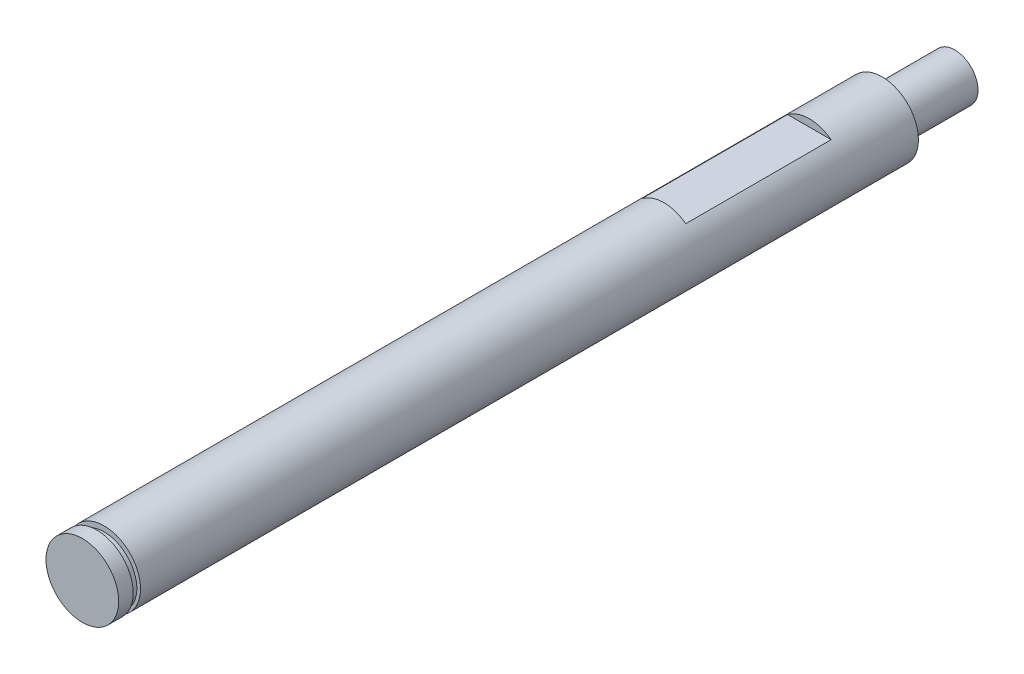
ISO-10303-21;
HEADER;
FILE_DESCRIPTION(('STEP AP214'),'2;1');
FILE_NAME('part.step','',(''),(''),'','','');
FILE_SCHEMA(('AUTOMOTIVE_DESIGN { 1 0 10303 214 1 1 1 1 }'));
ENDSEC;
DATA;
#1=APPLICATION_CONTEXT('core data for automotive mechanical design processes');
#2=APPLICATION_PROTOCOL_DEFINITION('international standard','automotive_design',2000,#1);
#3=PRODUCT_CONTEXT('',#1,'mechanical');
#4=PRODUCT('Part','Part','',(#3));
#5=PRODUCT_RELATED_PRODUCT_CATEGORY('part','',(#4));
#6=PRODUCT_DEFINITION_FORMATION('','',#4);
#7=PRODUCT_DEFINITION_CONTEXT('part definition',#1,'design');
#8=PRODUCT_DEFINITION('design','',#6,#7);
#9=PRODUCT_DEFINITION_SHAPE('','',#8);
#10=(LENGTH_UNIT() NAMED_UNIT(*) SI_UNIT(.MILLI.,.METRE.));
#11=(NAMED_UNIT(*) PLANE_ANGLE_UNIT() SI_UNIT($,.RADIAN.));
#12=(NAMED_UNIT(*) SI_UNIT($,.STERADIAN.) SOLID_ANGLE_UNIT());
#13=UNCERTAINTY_MEASURE_WITH_UNIT(LENGTH_MEASURE(1.E-05),#10,'distance_accuracy_value','');
#14=(GEOMETRIC_REPRESENTATION_CONTEXT(3) GLOBAL_UNCERTAINTY_ASSIGNED_CONTEXT((#13)) GLOBAL_UNIT_ASSIGNED_CONTEXT((#10,
#11,#12)) REPRESENTATION_CONTEXT('',''));
#15=CARTESIAN_POINT('',(0.,0.,0.));
#16=DIRECTION('',(0.,0.,1.));
#17=DIRECTION('',(1.,0.,0.));
#18=AXIS2_PLACEMENT_3D('',#15,#16,#17);
#19=CARTESIAN_POINT('',(0.,0.,59.9999999999997));
#20=DIRECTION('',(0.,0.,-0.999999999999996));
#21=DIRECTION('',(-0.999999999999992,0.,0.));
#22=AXIS2_PLACEMENT_3D('',#19,#20,#21);
#23=CYLINDRICAL_SURFACE('',#22,2.5);
#24=DIRECTION('',(0.,0.,-0.999999999999996));
#25=VECTOR('',#24,1.);
#26=CARTESIAN_POINT('',(1.5,-2.00000000000001,59.9999999999996));
#27=LINE('',#26,#25);
#28=CARTESIAN_POINT('',(1.5,-1.99999999999997,9.99999999999985));
#29=VERTEX_POINT('',#28);
#30=CARTESIAN_POINT('',(1.5,-2.,19.9999999999997));
#31=VERTEX_POINT('',#30);
#32=EDGE_CURVE('E91',#29,#31,#27,.F.);
#33=ORIENTED_EDGE('',*,*,#32,.F.);
#34=CARTESIAN_POINT('',(0.,0.,9.99999999999995));
#35=DIRECTION('',(0.,0.,-0.999999999999996));
#36=DIRECTION('',(-0.999999999999992,0.,0.));
#37=AXIS2_PLACEMENT_3D('',#34,#35,#36);
#38=CIRCLE('',#37,2.5);
#39=CARTESIAN_POINT('',(-1.49999999999999,-1.99999999999999,9.9999999999999));
#40=VERTEX_POINT('',#39);
#41=EDGE_CURVE('E55',#29,#40,#38,.T.);
#42=ORIENTED_EDGE('',*,*,#41,.T.);
#43=DIRECTION('',(0.,0.,-0.999999999999996));
#44=VECTOR('',#43,1.);
#45=CARTESIAN_POINT('',(-1.49999999999999,-1.99999999999999,59.9999999999997));
#46=LINE('',#45,#44);
#47=CARTESIAN_POINT('',(-1.49999999999999,-1.99999999999999,19.9999999999999));
#48=VERTEX_POINT('',#47);
#49=EDGE_CURVE('E89',#48,#40,#46,.T.);
#50=ORIENTED_EDGE('',*,*,#49,.F.);
#51=CARTESIAN_POINT('',(0.,0.,19.9999999999999));
#52=DIRECTION('',(0.,0.,0.999999999999996));
#53=DIRECTION('',(0.999999999999992,0.,0.));
#54=AXIS2_PLACEMENT_3D('',#51,#52,#53);
#55=CIRCLE('',#54,2.5);
#56=EDGE_CURVE('E96',#48,#31,#55,.T.);
#57=ORIENTED_EDGE('',*,*,#56,.T.);
#58=EDGE_LOOP('',(#33,#42,#50,#57));
#59=FACE_BOUND('',#58,.T.);
#60=CARTESIAN_POINT('',(0.,0.,4.99999999999997));
#61=DIRECTION('',(0.,0.,0.999999999999996));
#62=DIRECTION('',(0.999999999999992,0.,0.));
#63=AXIS2_PLACEMENT_3D('',#60,#61,#62);
#64=CIRCLE('',#63,2.5);
#65=CARTESIAN_POINT('',(2.49999999999998,0.,4.99999999999997));
#66=VERTEX_POINT('',#65);
#67=EDGE_CURVE('E103',#66,#66,#64,.T.);
#68=ORIENTED_EDGE('',*,*,#67,.T.);
#69=EDGE_LOOP('',(#68));
#70=FACE_BOUND('',#69,.T.);
#71=CARTESIAN_POINT('',(0.,0.,58.4999999999997));
#72=DIRECTION('',(0.,0.,0.999999999999996));
#73=DIRECTION('',(0.999999999999992,0.,0.));
#74=AXIS2_PLACEMENT_3D('',#71,#72,#73);
#75=CIRCLE('',#74,2.5);
#76=CARTESIAN_POINT('',(2.49999999999998,0.,58.4999999999997));
#77=VERTEX_POINT('',#76);
#78=EDGE_CURVE('E104',#77,#77,#75,.T.);
#79=ORIENTED_EDGE('',*,*,#78,.F.);
#80=EDGE_LOOP('',(#79));
#81=FACE_BOUND('',#80,.T.);
#82=CARTESIAN_POINT('',(0.,0.,19.9999999999999));
#83=DIRECTION('',(0.,0.,-0.999999999999996));
#84=DIRECTION('',(-0.999999999999992,0.,0.));
#85=AXIS2_PLACEMENT_3D('',#82,#83,#84);
#86=CIRCLE('',#85,2.5);
#87=CARTESIAN_POINT('',(-1.49999999999996,1.99999999999997,19.9999999999999));
#88=VERTEX_POINT('',#87);
#89=CARTESIAN_POINT('',(1.5000000000001,2.,19.9999999999999));
#90=VERTEX_POINT('',#89);
#91=EDGE_CURVE('E76',#88,#90,#86,.T.);
#92=ORIENTED_EDGE('',*,*,#91,.F.);
#93=DIRECTION('',(0.,0.,-0.999999999999996));
#94=VECTOR('',#93,1.);
#95=CARTESIAN_POINT('',(-1.49999999999996,1.99999999999999,59.9999999999997));
#96=LINE('',#95,#94);
#97=CARTESIAN_POINT('',(-1.49999999999999,1.99999999999997,9.99999999999995));
#98=VERTEX_POINT('',#97);
#99=EDGE_CURVE('E42',#98,#88,#96,.F.);
#100=ORIENTED_EDGE('',*,*,#99,.F.);
#101=CARTESIAN_POINT('',(0.,0.,9.99999999999995));
#102=DIRECTION('',(0.,0.,0.999999999999996));
#103=DIRECTION('',(0.999999999999992,0.,0.));
#104=AXIS2_PLACEMENT_3D('',#101,#102,#103);
#105=CIRCLE('',#104,2.5);
#106=CARTESIAN_POINT('',(1.5000000000001,2.00000000000001,9.99999999999996));
#107=VERTEX_POINT('',#106);
#108=EDGE_CURVE('E83',#107,#98,#105,.T.);
#109=ORIENTED_EDGE('',*,*,#108,.F.);
#110=DIRECTION('',(0.,0.,-0.999999999999996));
#111=VECTOR('',#110,1.);
#112=CARTESIAN_POINT('',(1.5000000000001,1.99999999999998,59.9999999999997));
#113=LINE('',#112,#111);
#114=EDGE_CURVE('E11',#90,#107,#113,.T.);
#115=ORIENTED_EDGE('',*,*,#114,.F.);
#116=EDGE_LOOP('',(#92,#100,#109,#115));
#117=FACE_BOUND('',#116,.T.);
#118=ADVANCED_FACE('F34',(#59,#70,#81,#117),#23,.T.);
#119=CARTESIAN_POINT('',(0.,0.,4.99999999999997));
#120=DIRECTION('',(0.,0.,-0.999999999999996));
#121=DIRECTION('',(-0.999999999999992,0.,0.));
#122=AXIS2_PLACEMENT_3D('',#119,#120,#121);
#123=CYLINDRICAL_SURFACE('',#122,1.6);
#124=CARTESIAN_POINT('',(0.,0.,4.99999999999997));
#125=DIRECTION('',(0.,0.,0.999999999999996));
#126=DIRECTION('',(0.999999999999992,0.,0.));
#127=AXIS2_PLACEMENT_3D('',#124,#125,#126);
#128=CIRCLE('',#127,1.6);
#129=CARTESIAN_POINT('',(-1.59999999999999,0.,4.99999999999997));
#130=VERTEX_POINT('',#129);
#131=EDGE_CURVE('E99',#130,#130,#128,.T.);
#132=CARTESIAN_POINT('',(0.,0.,0.));
#133=DIRECTION('',(0.,0.,0.999999999999996));
#134=DIRECTION('',(0.999999999999992,0.,0.));
#135=AXIS2_PLACEMENT_3D('',#132,#133,#134);
#136=CIRCLE('',#135,1.6);
#137=CARTESIAN_POINT('',(-1.59999999999999,0.,0.));
#138=VERTEX_POINT('',#137);
#139=EDGE_CURVE('E108',#138,#138,#136,.T.);
#140=CARTESIAN_POINT('',(-1.59999999999999,0.,4.99999999999997));
#141=CARTESIAN_POINT('',(-1.59999999999999,0.,4.94791666666664));
#142=CARTESIAN_POINT('',(-1.59999999999999,0.,4.8958333333333));
#143=CARTESIAN_POINT('',(-1.59999999999999,0.,4.79166666666664));
#144=CARTESIAN_POINT('',(-1.59999999999999,0.,4.7395833333333));
#145=CARTESIAN_POINT('',(-1.59999999999999,0.,4.63541666666664));
#146=CARTESIAN_POINT('',(-1.59999999999999,0.,4.58333333333331));
#147=CARTESIAN_POINT('',(-1.59999999999999,0.,4.47916666666664));
#148=CARTESIAN_POINT('',(-1.59999999999999,0.,4.42708333333331));
#149=CARTESIAN_POINT('',(-1.59999999999999,0.,4.32291666666664));
#150=CARTESIAN_POINT('',(-1.59999999999999,0.,4.27083333333331));
#151=CARTESIAN_POINT('',(-1.59999999999999,0.,4.16666666666664));
#152=CARTESIAN_POINT('',(-1.59999999999999,0.,4.11458333333331));
#153=CARTESIAN_POINT('',(-1.59999999999999,0.,4.01041666666664));
#154=CARTESIAN_POINT('',(-1.59999999999999,0.,3.95833333333331));
#155=CARTESIAN_POINT('',(-1.59999999999999,0.,3.85416666666664));
#156=CARTESIAN_POINT('',(-1.59999999999999,0.,3.80208333333331));
#157=CARTESIAN_POINT('',(-1.59999999999999,0.,3.69791666666664));
#158=CARTESIAN_POINT('',(-1.59999999999999,0.,3.64583333333331));
#159=CARTESIAN_POINT('',(-1.59999999999999,0.,3.54166666666665));
#160=CARTESIAN_POINT('',(-1.59999999999999,0.,3.48958333333331));
#161=CARTESIAN_POINT('',(-1.59999999999999,0.,3.38541666666665));
#162=CARTESIAN_POINT('',(-1.59999999999999,0.,3.33333333333331));
#163=CARTESIAN_POINT('',(-1.59999999999999,0.,3.22916666666665));
#164=CARTESIAN_POINT('',(-1.59999999999999,0.,3.17708333333331));
#165=CARTESIAN_POINT('',(-1.59999999999999,0.,3.07291666666665));
#166=CARTESIAN_POINT('',(-1.59999999999999,0.,3.02083333333332));
#167=CARTESIAN_POINT('',(-1.59999999999999,0.,2.91666666666665));
#168=CARTESIAN_POINT('',(-1.59999999999999,0.,2.86458333333332));
#169=CARTESIAN_POINT('',(-1.59999999999999,0.,2.76041666666665));
#170=CARTESIAN_POINT('',(-1.59999999999999,0.,2.70833333333332));
#171=CARTESIAN_POINT('',(-1.59999999999999,0.,2.60416666666665));
#172=CARTESIAN_POINT('',(-1.59999999999999,0.,2.55208333333332));
#173=CARTESIAN_POINT('',(-1.59999999999999,0.,2.44791666666665));
#174=CARTESIAN_POINT('',(-1.59999999999999,0.,2.39583333333332));
#175=CARTESIAN_POINT('',(-1.59999999999999,0.,2.29166666666665));
#176=CARTESIAN_POINT('',(-1.59999999999999,0.,2.23958333333332));
#177=CARTESIAN_POINT('',(-1.59999999999999,0.,2.13541666666665));
#178=CARTESIAN_POINT('',(-1.59999999999999,0.,2.08333333333332));
#179=CARTESIAN_POINT('',(-1.59999999999999,0.,1.97916666666666));
#180=CARTESIAN_POINT('',(-1.59999999999999,0.,1.92708333333332));
#181=CARTESIAN_POINT('',(-1.59999999999999,0.,1.82291666666666));
#182=CARTESIAN_POINT('',(-1.59999999999999,0.,1.77083333333332));
#183=CARTESIAN_POINT('',(-1.59999999999999,0.,1.66666666666666));
#184=CARTESIAN_POINT('',(-1.59999999999999,0.,1.61458333333332));
#185=CARTESIAN_POINT('',(-1.59999999999999,0.,1.51041666666666));
#186=CARTESIAN_POINT('',(-1.59999999999999,0.,1.45833333333333));
#187=CARTESIAN_POINT('',(-1.59999999999999,0.,1.35416666666666));
#188=CARTESIAN_POINT('',(-1.59999999999999,0.,1.30208333333333));
#189=CARTESIAN_POINT('',(-1.59999999999999,0.,1.19791666666666));
#190=CARTESIAN_POINT('',(-1.59999999999999,0.,1.14583333333333));
#191=CARTESIAN_POINT('',(-1.59999999999999,0.,1.04166666666666));
#192=CARTESIAN_POINT('',(-1.59999999999999,0.,0.989583333333328));
#193=CARTESIAN_POINT('',(-1.59999999999999,0.,0.885416666666662));
#194=CARTESIAN_POINT('',(-1.59999999999999,0.,0.833333333333329));
#195=CARTESIAN_POINT('',(-1.59999999999999,0.,0.729166666666663));
#196=CARTESIAN_POINT('',(-1.59999999999999,0.,0.67708333333333));
#197=CARTESIAN_POINT('',(-1.59999999999999,0.,0.572916666666663));
#198=CARTESIAN_POINT('',(-1.59999999999999,0.,0.52083333333333));
#199=CARTESIAN_POINT('',(-1.59999999999999,0.,0.416666666666664));
#200=CARTESIAN_POINT('',(-1.59999999999999,0.,0.364583333333331));
#201=CARTESIAN_POINT('',(-1.59999999999999,0.,0.260416666666666));
#202=CARTESIAN_POINT('',(-1.59999999999999,0.,0.208333333333333));
#203=CARTESIAN_POINT('',(-1.59999999999999,0.,0.104166666666667));
#204=CARTESIAN_POINT('',(-1.59999999999999,0.,0.0520833333333334));
#205=CARTESIAN_POINT('',(-1.59999999999999,0.,0.));
#206=B_SPLINE_CURVE_WITH_KNOTS('',3,(#140,#141,#142,#143,#144,#145,#146,#147,#148,#149,#150,
#151,#152,#153,#154,#155,#156,#157,#158,#159,#160,#161,#162,#163,#164,#165,#166,#167,#168,#169,
#170,#171,#172,#173,#174,#175,#176,#177,#178,#179,#180,#181,#182,#183,#184,#185,#186,#187,#188,
#189,#190,#191,#192,#193,#194,#195,#196,#197,#198,#199,#200,#201,#202,#203,#204,#205),
.UNSPECIFIED.,.F.,.F.,(4,2,2,2,2,2,2,2,2,2,2,2,2,2,2,2,2,2,2,2,2,2,2,2,2,2,2,2,2,2,2,2,4),(0.,
0.156249999999998,0.312499999999998,0.468749999999997,0.624999999999995,0.781249999999995,
0.937499999999994,1.09374999999999,1.24999999999999,1.40624999999999,1.56249999999999,
1.71874999999999,1.87499999999999,2.03124999999999,2.18749999999999,2.34374999999999,
2.49999999999998,2.65624999999998,2.81249999999998,2.96874999999998,3.12499999999998,
3.28124999999998,3.43749999999998,3.59374999999998,3.74999999999998,3.90624999999998,
4.06249999999998,4.21874999999997,4.37499999999997,4.53124999999997,4.68749999999997,
4.84374999999997,4.99999999999997),.UNSPECIFIED.);
#207=EDGE_CURVE('BSEAM36',#130,#138,#206,.T.);
#208=ORIENTED_EDGE('',*,*,#131,.F.);
#209=ORIENTED_EDGE('',*,*,#139,.T.);
#210=ORIENTED_EDGE('',*,*,#207,.T.);
#211=ORIENTED_EDGE('',*,*,#207,.F.);
#212=EDGE_LOOP('',(#208,#210,#209,#211));
#213=FACE_BOUND('',#212,.T.);
#214=ADVANCED_FACE('F36',(#213),#123,.T.);
#215=CARTESIAN_POINT('',(0.,0.,0.));
#216=DIRECTION('',(0.,0.,0.999999999999996));
#217=DIRECTION('',(0.999999999999992,0.,0.));
#218=AXIS2_PLACEMENT_3D('',#215,#216,#217);
#219=PLANE('',#218);
#220=ORIENTED_EDGE('',*,*,#139,.F.);
#221=EDGE_LOOP('',(#220));
#222=FACE_BOUND('',#221,.T.);
#223=ADVANCED_FACE('F145',(#222),#219,.F.);
#224=CARTESIAN_POINT('',(0.,0.,4.99999999999997));
#225=DIRECTION('',(0.,0.,0.999999999999996));
#226=DIRECTION('',(0.999999999999992,0.,0.));
#227=AXIS2_PLACEMENT_3D('',#224,#225,#226);
#228=PLANE('',#227);
#229=ORIENTED_EDGE('',*,*,#67,.F.);
#230=EDGE_LOOP('',(#229));
#231=FACE_BOUND('',#230,.T.);
#232=ORIENTED_EDGE('',*,*,#131,.T.);
#233=EDGE_LOOP('',(#232));
#234=FACE_BOUND('',#233,.T.);
#235=ADVANCED_FACE('F170',(#231,#234),#228,.F.);
#236=CARTESIAN_POINT('',(0.,4.1,58.9999999999997));
#237=DIRECTION('',(0.,0.,-0.999999999999996));
#238=DIRECTION('',(-0.999999999999992,0.,0.));
#239=AXIS2_PLACEMENT_3D('',#236,#237,#238);
#240=PLANE('',#239);
#241=CARTESIAN_POINT('',(0.,-0.105559951692605,58.9999999999997));
#242=DIRECTION('',(0.,0.,-0.999999999999996));
#243=DIRECTION('',(-0.999999999999992,0.,0.));
#244=AXIS2_PLACEMENT_3D('',#241,#242,#243);
#245=CIRCLE('',#244,2.24555995169259);
#246=CARTESIAN_POINT('',(-2.24555995169249,-0.105559951692591,58.9999999999997));
#247=VERTEX_POINT('',#246);
#248=EDGE_CURVE('E107',#247,#247,#245,.T.);
#249=ORIENTED_EDGE('',*,*,#248,.F.);
#250=EDGE_LOOP('',(#249));
#251=FACE_BOUND('',#250,.T.);
#252=CARTESIAN_POINT('',(0.,0.,58.9999999999997));
#253=DIRECTION('',(0.,0.,-0.999999999999996));
#254=DIRECTION('',(-0.999999999999992,0.,0.));
#255=AXIS2_PLACEMENT_3D('',#252,#253,#254);
#256=CIRCLE('',#255,2.5);
#257=CARTESIAN_POINT('',(-2.49999999999998,0.,58.9999999999997));
#258=VERTEX_POINT('',#257);
#259=EDGE_CURVE('E100',#258,#258,#256,.T.);
#260=ORIENTED_EDGE('',*,*,#259,.T.);
#261=EDGE_LOOP('',(#260));
#262=FACE_BOUND('',#261,.T.);
#263=ADVANCED_FACE('F167',(#251,#262),#240,.T.);
#264=CARTESIAN_POINT('',(0.,2.14,58.4999999999997));
#265=DIRECTION('',(0.,0.,0.999999999999996));
#266=DIRECTION('',(0.999999999999992,0.,0.));
#267=AXIS2_PLACEMENT_3D('',#264,#265,#266);
#268=PLANE('',#267);
#269=CARTESIAN_POINT('',(0.,-0.105559951692605,58.4999999999997));
#270=DIRECTION('',(0.,0.,-0.999999999999996));
#271=DIRECTION('',(-0.999999999999992,0.,0.));
#272=AXIS2_PLACEMENT_3D('',#269,#270,#271);
#273=CIRCLE('',#272,2.24555995169259);
#274=CARTESIAN_POINT('',(-2.24555995169249,-0.105559951692591,58.4999999999997));
#275=VERTEX_POINT('',#274);
#276=EDGE_CURVE('E120',#275,#275,#273,.T.);
#277=ORIENTED_EDGE('',*,*,#276,.T.);
#278=EDGE_LOOP('',(#277));
#279=FACE_BOUND('',#278,.T.);
#280=ORIENTED_EDGE('',*,*,#78,.T.);
#281=EDGE_LOOP('',(#280));
#282=FACE_BOUND('',#281,.T.);
#283=ADVANCED_FACE('F169',(#279,#282),#268,.T.);
#284=CARTESIAN_POINT('',(0.,-0.105559951692591,103.999999999999));
#285=DIRECTION('',(0.,0.,-0.999999999999996));
#286=DIRECTION('',(-0.999999999999992,0.,0.));
#287=AXIS2_PLACEMENT_3D('',#284,#285,#286);
#288=CYLINDRICAL_SURFACE('',#287,2.24555995169259);
#289=CARTESIAN_POINT('',(-2.24555995169249,-0.105559951692591,58.9999999999997));
#290=CARTESIAN_POINT('',(-2.24555995169249,-0.105559951692591,58.9947916666664));
#291=CARTESIAN_POINT('',(-2.24555995169249,-0.105559951692591,58.9895833333331));
#292=CARTESIAN_POINT('',(-2.24555995169249,-0.105559951692591,58.9791666666664));
#293=CARTESIAN_POINT('',(-2.24555995169249,-0.105559951692591,58.9739583333331));
#294=CARTESIAN_POINT('',(-2.24555995169249,-0.105559951692591,58.9635416666664));
#295=CARTESIAN_POINT('',(-2.24555995169249,-0.105559951692591,58.9583333333331));
#296=CARTESIAN_POINT('',(-2.24555995169249,-0.105559951692591,58.9479166666664));
#297=CARTESIAN_POINT('',(-2.24555995169249,-0.105559951692591,58.9427083333331));
#298=CARTESIAN_POINT('',(-2.24555995169249,-0.105559951692591,58.9322916666664));
#299=CARTESIAN_POINT('',(-2.24555995169249,-0.105559951692591,58.9270833333331));
#300=CARTESIAN_POINT('',(-2.24555995169249,-0.105559951692591,58.9166666666664));
#301=CARTESIAN_POINT('',(-2.24555995169249,-0.105559951692591,58.9114583333331));
#302=CARTESIAN_POINT('',(-2.24555995169249,-0.105559951692591,58.9010416666664));
#303=CARTESIAN_POINT('',(-2.24555995169249,-0.105559951692591,58.8958333333331));
#304=CARTESIAN_POINT('',(-2.24555995169249,-0.105559951692591,58.8854166666664));
#305=CARTESIAN_POINT('',(-2.24555995169249,-0.105559951692591,58.8802083333331));
#306=CARTESIAN_POINT('',(-2.24555995169249,-0.105559951692591,58.8697916666664));
#307=CARTESIAN_POINT('',(-2.24555995169249,-0.105559951692591,58.8645833333331));
#308=CARTESIAN_POINT('',(-2.24555995169249,-0.105559951692591,58.8541666666664));
#309=CARTESIAN_POINT('',(-2.24555995169249,-0.105559951692591,58.8489583333331));
#310=CARTESIAN_POINT('',(-2.24555995169249,-0.105559951692591,58.8385416666664));
#311=CARTESIAN_POINT('',(-2.24555995169249,-0.105559951692591,58.8333333333331));
#312=CARTESIAN_POINT('',(-2.24555995169249,-0.105559951692591,58.8229166666664));
#313=CARTESIAN_POINT('',(-2.24555995169249,-0.105559951692591,58.8177083333331));
#314=CARTESIAN_POINT('',(-2.24555995169249,-0.105559951692591,58.8072916666664));
#315=CARTESIAN_POINT('',(-2.24555995169249,-0.105559951692591,58.8020833333331));
#316=CARTESIAN_POINT('',(-2.24555995169249,-0.105559951692591,58.7916666666664));
#317=CARTESIAN_POINT('',(-2.24555995169249,-0.105559951692591,58.7864583333331));
#318=CARTESIAN_POINT('',(-2.24555995169249,-0.105559951692591,58.7760416666664));
#319=CARTESIAN_POINT('',(-2.24555995169249,-0.105559951692591,58.7708333333331));
#320=CARTESIAN_POINT('',(-2.24555995169249,-0.105559951692591,58.7604166666664));
#321=CARTESIAN_POINT('',(-2.24555995169249,-0.105559951692591,58.7552083333331));
#322=CARTESIAN_POINT('',(-2.24555995169249,-0.105559951692591,58.7447916666664));
#323=CARTESIAN_POINT('',(-2.24555995169249,-0.105559951692591,58.7395833333331));
#324=CARTESIAN_POINT('',(-2.24555995169249,-0.105559951692591,58.7291666666664));
#325=CARTESIAN_POINT('',(-2.24555995169249,-0.105559951692591,58.7239583333331));
#326=CARTESIAN_POINT('',(-2.24555995169249,-0.105559951692591,58.7135416666664));
#327=CARTESIAN_POINT('',(-2.24555995169249,-0.105559951692591,58.7083333333331));
#328=CARTESIAN_POINT('',(-2.24555995169249,-0.105559951692591,58.6979166666664));
#329=CARTESIAN_POINT('',(-2.24555995169249,-0.105559951692591,58.6927083333331));
#330=CARTESIAN_POINT('',(-2.24555995169249,-0.105559951692591,58.6822916666664));
#331=CARTESIAN_POINT('',(-2.24555995169249,-0.105559951692591,58.6770833333331));
#332=CARTESIAN_POINT('',(-2.24555995169249,-0.105559951692591,58.6666666666664));
#333=CARTESIAN_POINT('',(-2.24555995169249,-0.105559951692591,58.6614583333331));
#334=CARTESIAN_POINT('',(-2.24555995169249,-0.105559951692591,58.6510416666664));
#335=CARTESIAN_POINT('',(-2.24555995169249,-0.105559951692591,58.6458333333331));
#336=CARTESIAN_POINT('',(-2.24555995169249,-0.105559951692591,58.6354166666664));
#337=CARTESIAN_POINT('',(-2.24555995169249,-0.105559951692591,58.6302083333331));
#338=CARTESIAN_POINT('',(-2.24555995169249,-0.105559951692591,58.6197916666664));
#339=CARTESIAN_POINT('',(-2.24555995169249,-0.105559951692591,58.6145833333331));
#340=CARTESIAN_POINT('',(-2.24555995169249,-0.105559951692591,58.6041666666664));
#341=CARTESIAN_POINT('',(-2.24555995169249,-0.105559951692591,58.5989583333331));
#342=CARTESIAN_POINT('',(-2.24555995169249,-0.105559951692591,58.5885416666664));
#343=CARTESIAN_POINT('',(-2.24555995169249,-0.105559951692591,58.5833333333331));
#344=CARTESIAN_POINT('',(-2.24555995169249,-0.105559951692591,58.5729166666664));
#345=CARTESIAN_POINT('',(-2.24555995169249,-0.105559951692591,58.5677083333331));
#346=CARTESIAN_POINT('',(-2.24555995169249,-0.105559951692591,58.5572916666664));
#347=CARTESIAN_POINT('',(-2.24555995169249,-0.105559951692591,58.5520833333331));
#348=CARTESIAN_POINT('',(-2.24555995169249,-0.105559951692591,58.5416666666664));
#349=CARTESIAN_POINT('',(-2.24555995169249,-0.105559951692591,58.5364583333331));
#350=CARTESIAN_POINT('',(-2.24555995169249,-0.105559951692591,58.5260416666664));
#351=CARTESIAN_POINT('',(-2.24555995169249,-0.105559951692591,58.5208333333331));
#352=CARTESIAN_POINT('',(-2.24555995169249,-0.105559951692591,58.5104166666664));
#353=CARTESIAN_POINT('',(-2.24555995169249,-0.105559951692591,58.5052083333331));
#354=CARTESIAN_POINT('',(-2.24555995169249,-0.105559951692591,58.4999999999997));
#355=B_SPLINE_CURVE_WITH_KNOTS('',3,(#289,#290,#291,#292,#293,#294,#295,#296,#297,#298,#299,
#300,#301,#302,#303,#304,#305,#306,#307,#308,#309,#310,#311,#312,#313,#314,#315,#316,#317,#318,
#319,#320,#321,#322,#323,#324,#325,#326,#327,#328,#329,#330,#331,#332,#333,#334,#335,#336,#337,
#338,#339,#340,#341,#342,#343,#344,#345,#346,#347,#348,#349,#350,#351,#352,#353,#354),
.UNSPECIFIED.,.F.,.F.,(4,2,2,2,2,2,2,2,2,2,2,2,2,2,2,2,2,2,2,2,2,2,2,2,2,2,2,2,2,2,2,2,4),(0.,
0.0156249999999983,0.0312499999999966,0.0468750000000018,0.0625000000000001,0.0781249999999983,
0.0937500000000036,0.109375000000002,0.125,0.140624999999998,0.156249999999997,
0.171875000000002,0.1875,0.203124999999998,0.218750000000004,0.234374999999995,
0.249999999999993,0.265624999999992,0.28124999999999,0.296874999999995,0.312499999999993,
0.328124999999992,0.343749999999997,0.359374999999995,0.374999999999993,0.390624999999992,
0.40624999999999,0.421874999999995,0.437499999999993,0.453124999999992,0.468749999999997,
0.484374999999995,0.499999999999994),.UNSPECIFIED.);
#356=EDGE_CURVE('BSEAM160',#247,#275,#355,.T.);
#357=ORIENTED_EDGE('',*,*,#248,.T.);
#358=ORIENTED_EDGE('',*,*,#276,.F.);
#359=ORIENTED_EDGE('',*,*,#356,.T.);
#360=ORIENTED_EDGE('',*,*,#356,.F.);
#361=EDGE_LOOP('',(#357,#359,#358,#360));
#362=FACE_BOUND('',#361,.T.);
#363=ADVANCED_FACE('F160',(#362),#288,.T.);
#364=CARTESIAN_POINT('',(0.,0.,59.9999999999997));
#365=DIRECTION('',(0.,0.,0.999999999999996));
#366=DIRECTION('',(0.999999999999992,0.,0.));
#367=AXIS2_PLACEMENT_3D('',#364,#365,#366);
#368=PLANE('',#367);
#369=CARTESIAN_POINT('',(0.,0.,59.9999999999997));
#370=DIRECTION('',(0.,0.,0.999999999999996));
#371=DIRECTION('',(0.999999999999992,0.,0.));
#372=AXIS2_PLACEMENT_3D('',#369,#370,#371);
#373=CIRCLE('',#372,2.5);
#374=CARTESIAN_POINT('',(-2.49999999999998,0.,59.9999999999998));
#375=VERTEX_POINT('',#374);
#376=EDGE_CURVE('E111',#375,#375,#373,.T.);
#377=ORIENTED_EDGE('',*,*,#376,.T.);
#378=EDGE_LOOP('',(#377));
#379=FACE_BOUND('',#378,.T.);
#380=ADVANCED_FACE('F152',(#379),#368,.T.);
#381=CARTESIAN_POINT('',(-2.49999999999998,0.,59.9999999999998));
#382=CARTESIAN_POINT('',(-2.49999999999998,0.,59.9895833333331));
#383=CARTESIAN_POINT('',(-2.49999999999998,0.,59.9791666666664));
#384=CARTESIAN_POINT('',(-2.49999999999998,0.,59.9583333333331));
#385=CARTESIAN_POINT('',(-2.49999999999998,0.,59.9479166666664));
#386=CARTESIAN_POINT('',(-2.49999999999998,0.,59.9270833333331));
#387=CARTESIAN_POINT('',(-2.49999999999998,0.,59.9166666666664));
#388=CARTESIAN_POINT('',(-2.49999999999998,0.,59.8958333333331));
#389=CARTESIAN_POINT('',(-2.49999999999998,0.,59.8854166666664));
#390=CARTESIAN_POINT('',(-2.49999999999998,0.,59.8645833333331));
#391=CARTESIAN_POINT('',(-2.49999999999998,0.,59.8541666666664));
#392=CARTESIAN_POINT('',(-2.49999999999998,0.,59.8333333333331));
#393=CARTESIAN_POINT('',(-2.49999999999998,0.,59.8229166666664));
#394=CARTESIAN_POINT('',(-2.49999999999998,0.,59.8020833333331));
#395=CARTESIAN_POINT('',(-2.49999999999998,0.,59.7916666666664));
#396=CARTESIAN_POINT('',(-2.49999999999998,0.,59.7708333333331));
#397=CARTESIAN_POINT('',(-2.49999999999998,0.,59.7604166666664));
#398=CARTESIAN_POINT('',(-2.49999999999998,0.,59.7395833333331));
#399=CARTESIAN_POINT('',(-2.49999999999998,0.,59.7291666666664));
#400=CARTESIAN_POINT('',(-2.49999999999998,0.,59.7083333333331));
#401=CARTESIAN_POINT('',(-2.49999999999998,0.,59.6979166666664));
#402=CARTESIAN_POINT('',(-2.49999999999998,0.,59.6770833333331));
#403=CARTESIAN_POINT('',(-2.49999999999998,0.,59.6666666666664));
#404=CARTESIAN_POINT('',(-2.49999999999998,0.,59.6458333333331));
#405=CARTESIAN_POINT('',(-2.49999999999998,0.,59.6354166666664));
#406=CARTESIAN_POINT('',(-2.49999999999998,0.,59.6145833333331));
#407=CARTESIAN_POINT('',(-2.49999999999998,0.,59.6041666666664));
#408=CARTESIAN_POINT('',(-2.49999999999998,0.,59.5833333333331));
#409=CARTESIAN_POINT('',(-2.49999999999998,0.,59.5729166666664));
#410=CARTESIAN_POINT('',(-2.49999999999998,0.,59.5520833333331));
#411=CARTESIAN_POINT('',(-2.49999999999998,0.,59.5416666666664));
#412=CARTESIAN_POINT('',(-2.49999999999998,0.,59.5208333333331));
#413=CARTESIAN_POINT('',(-2.49999999999998,0.,59.5104166666664));
#414=CARTESIAN_POINT('',(-2.49999999999998,0.,59.4895833333331));
#415=CARTESIAN_POINT('',(-2.49999999999998,0.,59.4791666666664));
#416=CARTESIAN_POINT('',(-2.49999999999998,0.,59.4583333333331));
#417=CARTESIAN_POINT('',(-2.49999999999998,0.,59.4479166666664));
#418=CARTESIAN_POINT('',(-2.49999999999998,0.,59.4270833333331));
#419=CARTESIAN_POINT('',(-2.49999999999998,0.,59.4166666666664));
#420=CARTESIAN_POINT('',(-2.49999999999998,0.,59.3958333333331));
#421=CARTESIAN_POINT('',(-2.49999999999998,0.,59.3854166666664));
#422=CARTESIAN_POINT('',(-2.49999999999998,0.,59.3645833333331));
#423=CARTESIAN_POINT('',(-2.49999999999998,0.,59.3541666666664));
#424=CARTESIAN_POINT('',(-2.49999999999998,0.,59.3333333333331));
#425=CARTESIAN_POINT('',(-2.49999999999998,0.,59.3229166666664));
#426=CARTESIAN_POINT('',(-2.49999999999998,0.,59.3020833333331));
#427=CARTESIAN_POINT('',(-2.49999999999998,0.,59.2916666666664));
#428=CARTESIAN_POINT('',(-2.49999999999998,0.,59.2708333333331));
#429=CARTESIAN_POINT('',(-2.49999999999998,0.,59.2604166666664));
#430=CARTESIAN_POINT('',(-2.49999999999998,0.,59.2395833333331));
#431=CARTESIAN_POINT('',(-2.49999999999998,0.,59.2291666666664));
#432=CARTESIAN_POINT('',(-2.49999999999998,0.,59.2083333333331));
#433=CARTESIAN_POINT('',(-2.49999999999998,0.,59.1979166666664));
#434=CARTESIAN_POINT('',(-2.49999999999998,0.,59.1770833333331));
#435=CARTESIAN_POINT('',(-2.49999999999998,0.,59.1666666666664));
#436=CARTESIAN_POINT('',(-2.49999999999998,0.,59.1458333333331));
#437=CARTESIAN_POINT('',(-2.49999999999998,0.,59.1354166666664));
#438=CARTESIAN_POINT('',(-2.49999999999998,0.,59.1145833333331));
#439=CARTESIAN_POINT('',(-2.49999999999998,0.,59.1041666666664));
#440=CARTESIAN_POINT('',(-2.49999999999998,0.,59.0833333333331));
#441=CARTESIAN_POINT('',(-2.49999999999998,0.,59.0729166666664));
#442=CARTESIAN_POINT('',(-2.49999999999998,0.,59.0520833333331));
#443=CARTESIAN_POINT('',(-2.49999999999998,0.,59.0416666666664));
#444=CARTESIAN_POINT('',(-2.49999999999998,0.,59.0208333333331));
#445=CARTESIAN_POINT('',(-2.49999999999998,0.,59.0104166666664));
#446=CARTESIAN_POINT('',(-2.49999999999998,0.,58.9999999999997));
#447=B_SPLINE_CURVE_WITH_KNOTS('',3,(#381,#382,#383,#384,#385,#386,#387,#388,#389,#390,#391,
#392,#393,#394,#395,#396,#397,#398,#399,#400,#401,#402,#403,#404,#405,#406,#407,#408,#409,#410,
#411,#412,#413,#414,#415,#416,#417,#418,#419,#420,#421,#422,#423,#424,#425,#426,#427,#428,#429,
#430,#431,#432,#433,#434,#435,#436,#437,#438,#439,#440,#441,#442,#443,#444,#445,#446),
.UNSPECIFIED.,.F.,.F.,(4,2,2,2,2,2,2,2,2,2,2,2,2,2,2,2,2,2,2,2,2,2,2,2,2,2,2,2,2,2,2,2,4),(0.,
0.0312500000000035,0.062500000000007,0.0937500000000036,0.125000000000007,0.156250000000004,
0.187500000000007,0.218750000000004,0.250000000000007,0.281250000000004,0.312500000000007,
0.343750000000004,0.375000000000007,0.406250000000004,0.437500000000007,0.468750000000004,
0.500000000000007,0.531250000000004,0.562500000000007,0.593750000000004,0.625000000000008,
0.656250000000004,0.687500000000008,0.718750000000004,0.750000000000008,0.781250000000004,
0.812500000000008,0.843750000000004,0.875000000000008,0.906250000000004,0.937500000000008,
0.968750000000004,1.00000000000001),.UNSPECIFIED.);
#448=EDGE_CURVE('BSEAM141',#375,#258,#447,.T.);
#449=ORIENTED_EDGE('',*,*,#376,.F.);
#450=ORIENTED_EDGE('',*,*,#259,.F.);
#451=ORIENTED_EDGE('',*,*,#448,.T.);
#452=ORIENTED_EDGE('',*,*,#448,.F.);
#453=EDGE_LOOP('',(#449,#451,#450,#452));
#454=FACE_BOUND('',#453,.T.);
#455=ADVANCED_FACE('F141',(#454),#23,.T.);
#456=CARTESIAN_POINT('',(3.74054091692248,-2.00000000000001,9.99999999999985));
#457=DIRECTION('',(0.,0.,-0.999999999999996));
#458=DIRECTION('',(-0.999999999999992,0.,0.));
#459=AXIS2_PLACEMENT_3D('',#456,#457,#458);
#460=PLANE('',#459);
#461=DIRECTION('',(0.999999999999992,0.,0.));
#462=VECTOR('',#461,1.);
#463=CARTESIAN_POINT('',(3.74054091692248,-2.00000000000001,9.99999999999985));
#464=LINE('',#463,#462);
#465=EDGE_CURVE('E123',#40,#29,#464,.T.);
#466=ORIENTED_EDGE('',*,*,#465,.F.);
#467=ORIENTED_EDGE('',*,*,#41,.F.);
#468=EDGE_LOOP('',(#466,#467));
#469=FACE_BOUND('',#468,.T.);
#470=ADVANCED_FACE('F151',(#469),#460,.F.);
#471=CARTESIAN_POINT('',(3.7405409169225,-2.,19.9999999999997));
#472=DIRECTION('',(0.,0.,0.999999999999996));
#473=DIRECTION('',(0.999999999999992,0.,0.));
#474=AXIS2_PLACEMENT_3D('',#471,#472,#473);
#475=PLANE('',#474);
#476=DIRECTION('',(-0.999999999999992,0.,0.));
#477=VECTOR('',#476,1.);
#478=CARTESIAN_POINT('',(3.7405409169225,-2.,19.9999999999997));
#479=LINE('',#478,#477);
#480=EDGE_CURVE('E86',#31,#48,#479,.T.);
#481=ORIENTED_EDGE('',*,*,#480,.F.);
#482=ORIENTED_EDGE('',*,*,#56,.F.);
#483=EDGE_LOOP('',(#481,#482));
#484=FACE_BOUND('',#483,.T.);
#485=ADVANCED_FACE('F158',(#484),#475,.F.);
#486=CARTESIAN_POINT('',(3.7405409169225,-2.,19.9999999999997));
#487=DIRECTION('',(0.,-0.999999999999998,0.));
#488=DIRECTION('',(0.,0.,-0.999999999999996));
#489=AXIS2_PLACEMENT_3D('',#486,#487,#488);
#490=PLANE('',#489);
#491=ORIENTED_EDGE('',*,*,#49,.T.);
#492=ORIENTED_EDGE('',*,*,#465,.T.);
#493=ORIENTED_EDGE('',*,*,#32,.T.);
#494=ORIENTED_EDGE('',*,*,#480,.T.);
#495=EDGE_LOOP('',(#491,#492,#493,#494));
#496=FACE_BOUND('',#495,.T.);
#497=ADVANCED_FACE('F135',(#496),#490,.T.);
#498=CARTESIAN_POINT('',(3.74054091692248,2.00000000000001,19.9999999999997));
#499=DIRECTION('',(0.,0.,-0.999999999999996));
#500=DIRECTION('',(-0.999999999999992,0.,0.));
#501=AXIS2_PLACEMENT_3D('',#498,#499,#500);
#502=PLANE('',#501);
#503=DIRECTION('',(-0.999999999999992,0.,0.));
#504=VECTOR('',#503,1.);
#505=CARTESIAN_POINT('',(3.74054091692248,2.00000000000001,19.9999999999997));
#506=LINE('',#505,#504);
#507=EDGE_CURVE('E79',#90,#88,#506,.T.);
#508=ORIENTED_EDGE('',*,*,#507,.T.);
#509=ORIENTED_EDGE('',*,*,#91,.T.);
#510=EDGE_LOOP('',(#508,#509));
#511=FACE_BOUND('',#510,.T.);
#512=ADVANCED_FACE('F78',(#511),#502,.T.);
#513=CARTESIAN_POINT('',(3.74054091692248,2.,9.99999999999985));
#514=DIRECTION('',(0.,0.,0.999999999999996));
#515=DIRECTION('',(0.999999999999992,0.,0.));
#516=AXIS2_PLACEMENT_3D('',#513,#514,#515);
#517=PLANE('',#516);
#518=DIRECTION('',(0.999999999999992,0.,0.));
#519=VECTOR('',#518,1.);
#520=CARTESIAN_POINT('',(3.74054091692248,2.,9.99999999999985));
#521=LINE('',#520,#519);
#522=EDGE_CURVE('E48',#98,#107,#521,.T.);
#523=ORIENTED_EDGE('',*,*,#522,.T.);
#524=ORIENTED_EDGE('',*,*,#108,.T.);
#525=EDGE_LOOP('',(#523,#524));
#526=FACE_BOUND('',#525,.T.);
#527=ADVANCED_FACE('F127',(#526),#517,.T.);
#528=CARTESIAN_POINT('',(3.74054091692248,2.00000000000001,19.9999999999997));
#529=DIRECTION('',(0.,0.999999999999998,0.));
#530=DIRECTION('',(0.,0.,-0.999999999999996));
#531=AXIS2_PLACEMENT_3D('',#528,#529,#530);
#532=PLANE('',#531);
#533=ORIENTED_EDGE('',*,*,#114,.T.);
#534=ORIENTED_EDGE('',*,*,#522,.F.);
#535=ORIENTED_EDGE('',*,*,#99,.T.);
#536=ORIENTED_EDGE('',*,*,#507,.F.);
#537=EDGE_LOOP('',(#533,#534,#535,#536));
#538=FACE_BOUND('',#537,.T.);
#539=ADVANCED_FACE('F85',(#538),#532,.T.);
#540=CLOSED_SHELL('',(#118,#214,#223,#235,#263,#283,#363,#380,#455,#470,#485,#497,#512,#527,#539));
#541=MANIFOLD_SOLID_BREP('B2',#540);
#542=ADVANCED_BREP_SHAPE_REPRESENTATION('',(#18,#541),#14);
#543=SHAPE_DEFINITION_REPRESENTATION(#9,#542);
ENDSEC;
END-ISO-10303-21;
